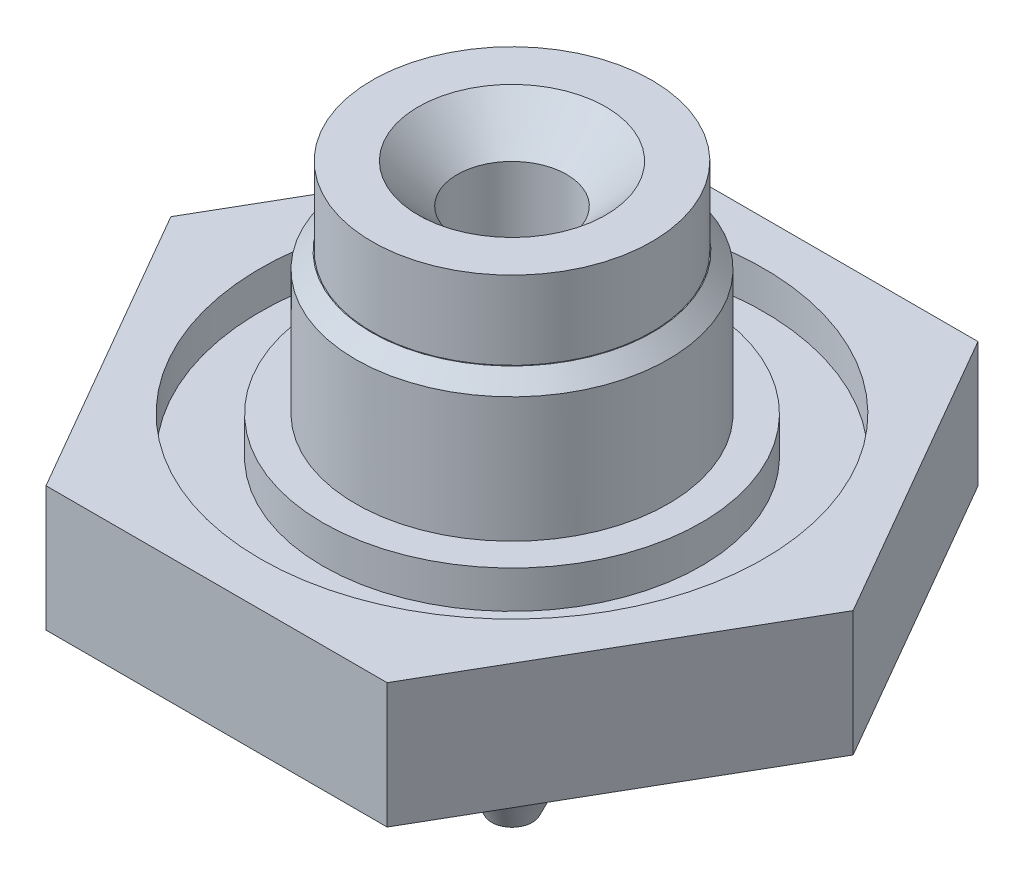
ISO-10303-21;
HEADER;
FILE_DESCRIPTION(('STEP AP214'),'2;1');
FILE_NAME('part.step','',(''),(''),'','','');
FILE_SCHEMA(('AUTOMOTIVE_DESIGN { 1 0 10303 214 1 1 1 1 }'));
ENDSEC;
DATA;
#1=APPLICATION_CONTEXT('core data for automotive mechanical design processes');
#2=APPLICATION_PROTOCOL_DEFINITION('international standard','automotive_design',2000,#1);
#3=PRODUCT_CONTEXT('',#1,'mechanical');
#4=PRODUCT('Part','Part','',(#3));
#5=PRODUCT_RELATED_PRODUCT_CATEGORY('part','',(#4));
#6=PRODUCT_DEFINITION_FORMATION('','',#4);
#7=PRODUCT_DEFINITION_CONTEXT('part definition',#1,'design');
#8=PRODUCT_DEFINITION('design','',#6,#7);
#9=PRODUCT_DEFINITION_SHAPE('','',#8);
#10=(LENGTH_UNIT() NAMED_UNIT(*) SI_UNIT(.MILLI.,.METRE.));
#11=(NAMED_UNIT(*) PLANE_ANGLE_UNIT() SI_UNIT($,.RADIAN.));
#12=(NAMED_UNIT(*) SI_UNIT($,.STERADIAN.) SOLID_ANGLE_UNIT());
#13=UNCERTAINTY_MEASURE_WITH_UNIT(LENGTH_MEASURE(1.E-05),#10,'distance_accuracy_value','');
#14=(GEOMETRIC_REPRESENTATION_CONTEXT(3) GLOBAL_UNCERTAINTY_ASSIGNED_CONTEXT((#13)) GLOBAL_UNIT_ASSIGNED_CONTEXT((#10,
#11,#12)) REPRESENTATION_CONTEXT('',''));
#15=CARTESIAN_POINT('',(0.,0.,0.));
#16=DIRECTION('',(0.,0.,1.));
#17=DIRECTION('',(1.,0.,0.));
#18=AXIS2_PLACEMENT_3D('',#15,#16,#17);
#19=CARTESIAN_POINT('',(5.,11.,0.));
#20=DIRECTION('',(0.,1.,0.));
#21=DIRECTION('',(0.,0.,1.));
#22=AXIS2_PLACEMENT_3D('',#19,#20,#21);
#23=PLANE('',#22);
#24=CARTESIAN_POINT('',(0.,11.,0.));
#25=DIRECTION('',(0.,-1.,0.));
#26=DIRECTION('',(0.,0.,-1.));
#27=AXIS2_PLACEMENT_3D('',#24,#25,#26);
#28=CIRCLE('',#27,5.);
#29=CARTESIAN_POINT('',(0.,11.,-5.));
#30=VERTEX_POINT('',#29);
#31=EDGE_CURVE('E162',#30,#30,#28,.T.);
#32=ORIENTED_EDGE('',*,*,#31,.T.);
#33=EDGE_LOOP('',(#32));
#34=FACE_BOUND('',#33,.T.);
#35=CARTESIAN_POINT('',(0.,11.,0.));
#36=DIRECTION('',(0.,1.,0.));
#37=DIRECTION('',(0.,0.,1.));
#38=AXIS2_PLACEMENT_3D('',#35,#36,#37);
#39=CIRCLE('',#38,6.05);
#40=CARTESIAN_POINT('',(0.,11.,6.05));
#41=VERTEX_POINT('',#40);
#42=EDGE_CURVE('E216',#41,#41,#39,.T.);
#43=ORIENTED_EDGE('',*,*,#42,.T.);
#44=EDGE_LOOP('',(#43));
#45=FACE_BOUND('',#44,.T.);
#46=ADVANCED_FACE('F35',(#34,#45),#23,.T.);
#47=CARTESIAN_POINT('',(12.5,7.,0.));
#48=DIRECTION('',(0.,-1.,0.));
#49=DIRECTION('',(0.,0.,-1.));
#50=AXIS2_PLACEMENT_3D('',#47,#48,#49);
#51=PLANE('',#50);
#52=CARTESIAN_POINT('',(0.,7.,0.));
#53=DIRECTION('',(0.,-1.,0.));
#54=DIRECTION('',(0.,0.,-1.));
#55=AXIS2_PLACEMENT_3D('',#52,#53,#54);
#56=CIRCLE('',#55,3.91415360708497);
#57=CARTESIAN_POINT('',(0.,7.,3.91415360708497));
#58=VERTEX_POINT('',#57);
#59=EDGE_CURVE('E165',#58,#58,#56,.T.);
#60=ORIENTED_EDGE('',*,*,#59,.F.);
#61=EDGE_LOOP('',(#60));
#62=FACE_BOUND('',#61,.T.);
#63=DIRECTION('',(-1.,0.,0.));
#64=VECTOR('',#63,1.);
#65=CARTESIAN_POINT('',(12.5,7.,9.45000000000004));
#66=LINE('',#65,#64);
#67=CARTESIAN_POINT('',(5.45596004384196,7.,9.45000000000004));
#68=VERTEX_POINT('',#67);
#69=CARTESIAN_POINT('',(-5.45596004384195,7.,9.45000000000004));
#70=VERTEX_POINT('',#69);
#71=EDGE_CURVE('E121',#68,#70,#66,.T.);
#72=ORIENTED_EDGE('',*,*,#71,.T.);
#73=DIRECTION('',(-0.499999999999998,0.,-0.86602540378444));
#74=VECTOR('',#73,1.);
#75=CARTESIAN_POINT('',(-5.05894006576299,7.,10.1376587736527));
#76=LINE('',#75,#74);
#77=CARTESIAN_POINT('',(-10.911920087684,7.,0.));
#78=VERTEX_POINT('',#77);
#79=EDGE_CURVE('E138',#70,#78,#76,.T.);
#80=ORIENTED_EDGE('',*,*,#79,.T.);
#81=DIRECTION('',(0.500000000000004,0.,-0.866025403784436));
#82=VECTOR('',#81,1.);
#83=CARTESIAN_POINT('',(-5.05894006576291,7.,-10.1376587736528));
#84=LINE('',#83,#82);
#85=CARTESIAN_POINT('',(-5.45596004384195,7.,-9.45000000000004));
#86=VERTEX_POINT('',#85);
#87=EDGE_CURVE('E135',#78,#86,#84,.T.);
#88=ORIENTED_EDGE('',*,*,#87,.T.);
#89=DIRECTION('',(1.,0.,0.));
#90=VECTOR('',#89,1.);
#91=CARTESIAN_POINT('',(12.5,7.,-9.45000000000004));
#92=LINE('',#91,#90);
#93=CARTESIAN_POINT('',(5.45596004384196,7.,-9.45000000000004));
#94=VERTEX_POINT('',#93);
#95=EDGE_CURVE('E132',#86,#94,#92,.T.);
#96=ORIENTED_EDGE('',*,*,#95,.T.);
#97=DIRECTION('',(0.499999999999998,0.,0.86602540378444));
#98=VECTOR('',#97,1.);
#99=CARTESIAN_POINT('',(11.3089400657629,7.,0.687658773652745));
#100=LINE('',#99,#98);
#101=CARTESIAN_POINT('',(10.911920087684,7.,0.));
#102=VERTEX_POINT('',#101);
#103=EDGE_CURVE('E130',#94,#102,#100,.T.);
#104=ORIENTED_EDGE('',*,*,#103,.T.);
#105=DIRECTION('',(-0.500000000000004,0.,0.866025403784436));
#106=VECTOR('',#105,1.);
#107=CARTESIAN_POINT('',(11.308940065763,7.,-0.687658773652709));
#108=LINE('',#107,#106);
#109=EDGE_CURVE('E91',#102,#68,#108,.T.);
#110=ORIENTED_EDGE('',*,*,#109,.T.);
#111=EDGE_LOOP('',(#72,#80,#88,#96,#104,#110));
#112=FACE_BOUND('',#111,.T.);
#113=ADVANCED_FACE('F189',(#62,#112),#51,.T.);
#114=CARTESIAN_POINT('',(0.,11.,0.));
#115=DIRECTION('',(0.,1.,0.));
#116=DIRECTION('',(0.,0.,1.));
#117=AXIS2_PLACEMENT_3D('',#114,#115,#116);
#118=CIRCLE('',#117,8.05);
#119=CARTESIAN_POINT('',(0.,11.,8.05));
#120=VERTEX_POINT('',#119);
#121=EDGE_CURVE('E208',#120,#120,#118,.T.);
#122=ORIENTED_EDGE('',*,*,#121,.F.);
#123=EDGE_LOOP('',(#122));
#124=FACE_BOUND('',#123,.T.);
#125=DIRECTION('',(-0.500000000000004,0.,0.866025403784436));
#126=VECTOR('',#125,1.);
#127=CARTESIAN_POINT('',(-10.911920087684,11.,0.));
#128=LINE('',#127,#126);
#129=CARTESIAN_POINT('',(-5.45596004384195,11.,-9.45000000000004));
#130=VERTEX_POINT('',#129);
#131=CARTESIAN_POINT('',(-10.911920087684,11.,0.));
#132=VERTEX_POINT('',#131);
#133=EDGE_CURVE('E117',#130,#132,#128,.T.);
#134=ORIENTED_EDGE('',*,*,#133,.T.);
#135=DIRECTION('',(0.499999999999998,0.,0.86602540378444));
#136=VECTOR('',#135,1.);
#137=CARTESIAN_POINT('',(-5.45596004384195,11.,9.45000000000004));
#138=LINE('',#137,#136);
#139=CARTESIAN_POINT('',(-5.45596004384195,11.,9.45000000000004));
#140=VERTEX_POINT('',#139);
#141=EDGE_CURVE('E112',#132,#140,#138,.T.);
#142=ORIENTED_EDGE('',*,*,#141,.T.);
#143=DIRECTION('',(1.,0.,0.));
#144=VECTOR('',#143,1.);
#145=CARTESIAN_POINT('',(5.45596004384196,11.,9.45000000000004));
#146=LINE('',#145,#144);
#147=CARTESIAN_POINT('',(5.45596004384196,11.,9.45000000000004));
#148=VERTEX_POINT('',#147);
#149=EDGE_CURVE('E110',#140,#148,#146,.T.);
#150=ORIENTED_EDGE('',*,*,#149,.T.);
#151=DIRECTION('',(0.500000000000004,0.,-0.866025403784436));
#152=VECTOR('',#151,1.);
#153=CARTESIAN_POINT('',(10.911920087684,11.,0.));
#154=LINE('',#153,#152);
#155=CARTESIAN_POINT('',(10.911920087684,11.,0.));
#156=VERTEX_POINT('',#155);
#157=EDGE_CURVE('E58',#148,#156,#154,.T.);
#158=ORIENTED_EDGE('',*,*,#157,.T.);
#159=DIRECTION('',(-0.499999999999998,0.,-0.86602540378444));
#160=VECTOR('',#159,1.);
#161=CARTESIAN_POINT('',(5.45596004384196,11.,-9.45000000000004));
#162=LINE('',#161,#160);
#163=CARTESIAN_POINT('',(5.45596004384196,11.,-9.45000000000004));
#164=VERTEX_POINT('',#163);
#165=EDGE_CURVE('E98',#156,#164,#162,.T.);
#166=ORIENTED_EDGE('',*,*,#165,.T.);
#167=DIRECTION('',(-1.,0.,0.));
#168=VECTOR('',#167,1.);
#169=CARTESIAN_POINT('',(-5.45596004384195,11.,-9.45000000000004));
#170=LINE('',#169,#168);
#171=EDGE_CURVE('E104',#164,#130,#170,.T.);
#172=ORIENTED_EDGE('',*,*,#171,.T.);
#173=EDGE_LOOP('',(#134,#142,#150,#158,#166,#172));
#174=FACE_BOUND('',#173,.T.);
#175=ADVANCED_FACE('F108',(#124,#174),#23,.T.);
#176=CARTESIAN_POINT('',(0.,0.,0.));
#177=DIRECTION('',(0.,1.,0.));
#178=DIRECTION('',(0.,0.,1.));
#179=AXIS2_PLACEMENT_3D('',#176,#177,#178);
#180=CONICAL_SURFACE('',#179,0.65,0.43633231299858);
#181=CARTESIAN_POINT('',(0.,0.,0.));
#182=DIRECTION('',(0.,-1.,0.));
#183=DIRECTION('',(0.,0.,-1.));
#184=AXIS2_PLACEMENT_3D('',#181,#182,#183);
#185=CIRCLE('',#184,0.65);
#186=CARTESIAN_POINT('',(0.,0.,0.65));
#187=VERTEX_POINT('',#186);
#188=EDGE_CURVE('E141',#187,#187,#185,.T.);
#189=CARTESIAN_POINT('',(0.,7.,3.91415360708497));
#190=CARTESIAN_POINT('',(0.,6.92708333333333,3.88015200701117));
#191=CARTESIAN_POINT('',(0.,6.85416666666666,3.84615040693737));
#192=CARTESIAN_POINT('',(0.,6.70833333333333,3.77814720678976));
#193=CARTESIAN_POINT('',(0.,6.63541666666666,3.74414560671596));
#194=CARTESIAN_POINT('',(0.,6.48958333333333,3.67614240656836));
#195=CARTESIAN_POINT('',(0.,6.41666666666666,3.64214080649456));
#196=CARTESIAN_POINT('',(0.,6.27083333333333,3.57413760634695));
#197=CARTESIAN_POINT('',(0.,6.19791666666666,3.54013600627315));
#198=CARTESIAN_POINT('',(0.,6.05208333333333,3.47213280612555));
#199=CARTESIAN_POINT('',(0.,5.97916666666667,3.43813120605174));
#200=CARTESIAN_POINT('',(0.,5.83333333333333,3.37012800590414));
#201=CARTESIAN_POINT('',(0.,5.76041666666666,3.33612640583034));
#202=CARTESIAN_POINT('',(0.,5.61458333333333,3.26812320568273));
#203=CARTESIAN_POINT('',(0.,5.54166666666666,3.23412160560893));
#204=CARTESIAN_POINT('',(0.,5.39583333333333,3.16611840546133));
#205=CARTESIAN_POINT('',(0.,5.32291666666666,3.13211680538753));
#206=CARTESIAN_POINT('',(0.,5.17708333333333,3.06411360523992));
#207=CARTESIAN_POINT('',(0.,5.10416666666667,3.03011200516612));
#208=CARTESIAN_POINT('',(0.,4.95833333333333,2.96210880501852));
#209=CARTESIAN_POINT('',(0.,4.88541666666666,2.92810720494472));
#210=CARTESIAN_POINT('',(0.,4.73958333333333,2.86010400479711));
#211=CARTESIAN_POINT('',(0.,4.66666666666667,2.82610240472331));
#212=CARTESIAN_POINT('',(0.,4.52083333333333,2.75809920457571));
#213=CARTESIAN_POINT('',(0.,4.44791666666667,2.72409760450191));
#214=CARTESIAN_POINT('',(0.,4.30208333333333,2.6560944043543));
#215=CARTESIAN_POINT('',(0.,4.22916666666667,2.6220928042805));
#216=CARTESIAN_POINT('',(0.,4.08333333333333,2.5540896041329));
#217=CARTESIAN_POINT('',(0.,4.01041666666666,2.5200880040591));
#218=CARTESIAN_POINT('',(0.,3.86458333333333,2.45208480391149));
#219=CARTESIAN_POINT('',(0.,3.79166666666667,2.41808320383769));
#220=CARTESIAN_POINT('',(0.,3.64583333333333,2.35008000369009));
#221=CARTESIAN_POINT('',(0.,3.57291666666667,2.31607840361629));
#222=CARTESIAN_POINT('',(0.,3.42708333333333,2.24807520346868));
#223=CARTESIAN_POINT('',(0.,3.35416666666667,2.21407360339488));
#224=CARTESIAN_POINT('',(0.,3.20833333333333,2.14607040324728));
#225=CARTESIAN_POINT('',(0.,3.13541666666667,2.11206880317348));
#226=CARTESIAN_POINT('',(0.,2.98958333333333,2.04406560302587));
#227=CARTESIAN_POINT('',(0.,2.91666666666667,2.01006400295207));
#228=CARTESIAN_POINT('',(0.,2.77083333333333,1.94206080280447));
#229=CARTESIAN_POINT('',(0.,2.69791666666667,1.90805920273067));
#230=CARTESIAN_POINT('',(0.,2.55208333333333,1.84005600258306));
#231=CARTESIAN_POINT('',(0.,2.47916666666667,1.80605440250926));
#232=CARTESIAN_POINT('',(0.,2.33333333333333,1.73805120236166));
#233=CARTESIAN_POINT('',(0.,2.26041666666667,1.70404960228785));
#234=CARTESIAN_POINT('',(0.,2.11458333333333,1.63604640214025));
#235=CARTESIAN_POINT('',(0.,2.04166666666667,1.60204480206645));
#236=CARTESIAN_POINT('',(0.,1.89583333333333,1.53404160191885));
#237=CARTESIAN_POINT('',(0.,1.82291666666667,1.50004000184504));
#238=CARTESIAN_POINT('',(0.,1.67708333333333,1.43203680169744));
#239=CARTESIAN_POINT('',(0.,1.60416666666667,1.39803520162364));
#240=CARTESIAN_POINT('',(0.,1.45833333333333,1.33003200147604));
#241=CARTESIAN_POINT('',(0.,1.38541666666667,1.29603040140223));
#242=CARTESIAN_POINT('',(0.,1.23958333333333,1.22802720125463));
#243=CARTESIAN_POINT('',(0.,1.16666666666667,1.19402560118083));
#244=CARTESIAN_POINT('',(0.,1.02083333333333,1.12602240103322));
#245=CARTESIAN_POINT('',(0.,0.947916666666666,1.09202080095942));
#246=CARTESIAN_POINT('',(0.,0.802083333333333,1.02401760081182));
#247=CARTESIAN_POINT('',(0.,0.729166666666667,0.990016000738018));
#248=CARTESIAN_POINT('',(0.,0.583333333333333,0.922012800590414));
#249=CARTESIAN_POINT('',(0.,0.510416666666666,0.888011200516612));
#250=CARTESIAN_POINT('',(0.,0.364583333333333,0.820008000369009));
#251=CARTESIAN_POINT('',(0.,0.291666666666667,0.786006400295207));
#252=CARTESIAN_POINT('',(0.,0.145833333333333,0.718003200147604));
#253=CARTESIAN_POINT('',(0.,0.0729166666666666,0.684001600073802));
#254=CARTESIAN_POINT('',(0.,0.,0.65));
#255=B_SPLINE_CURVE_WITH_KNOTS('',3,(#189,#190,#191,#192,#193,#194,#195,#196,#197,#198,#199,
#200,#201,#202,#203,#204,#205,#206,#207,#208,#209,#210,#211,#212,#213,#214,#215,#216,#217,#218,
#219,#220,#221,#222,#223,#224,#225,#226,#227,#228,#229,#230,#231,#232,#233,#234,#235,#236,#237,
#238,#239,#240,#241,#242,#243,#244,#245,#246,#247,#248,#249,#250,#251,#252,#253,#254),
.UNSPECIFIED.,.F.,.F.,(4,2,2,2,2,2,2,2,2,2,2,2,2,2,2,2,2,2,2,2,2,2,2,2,2,2,2,2,2,2,2,2,4),(0.,
0.241363919773045,0.482727839546089,0.724091759319134,0.965455679092179,1.20681959886522,
1.44818351863827,1.68954743841131,1.93091135818436,2.1722752779574,2.41363919773045,
2.65500311750349,2.89636703727654,3.13773095704958,3.37909487682263,3.62045879659567,
3.86182271636872,4.10318663614176,4.3445505559148,4.58591447568785,4.82727839546089,
5.06864231523394,5.31000623500698,5.55137015478003,5.79273407455307,6.03409799432612,
6.27546191409916,6.5168258338722,6.75818975364525,6.99955367341829,7.24091759319134,
7.48228151296438,7.72364543273743),.UNSPECIFIED.);
#256=EDGE_CURVE('BSEAM200',#58,#187,#255,.T.);
#257=ORIENTED_EDGE('',*,*,#59,.T.);
#258=ORIENTED_EDGE('',*,*,#188,.F.);
#259=ORIENTED_EDGE('',*,*,#256,.T.);
#260=ORIENTED_EDGE('',*,*,#256,.F.);
#261=EDGE_LOOP('',(#257,#259,#258,#260));
#262=FACE_BOUND('',#261,.T.);
#263=ADVANCED_FACE('F200',(#262),#180,.T.);
#264=CARTESIAN_POINT('',(0.,0.,0.));
#265=DIRECTION('',(0.,-1.,0.));
#266=DIRECTION('',(0.,0.,-1.));
#267=AXIS2_PLACEMENT_3D('',#264,#265,#266);
#268=CYLINDRICAL_SURFACE('',#267,5.);
#269=CARTESIAN_POINT('',(0.,15.,0.));
#270=DIRECTION('',(0.,1.,0.));
#271=DIRECTION('',(0.,0.,1.));
#272=AXIS2_PLACEMENT_3D('',#269,#270,#271);
#273=CIRCLE('',#272,5.);
#274=CARTESIAN_POINT('',(0.,15.,5.));
#275=VERTEX_POINT('',#274);
#276=EDGE_CURVE('E43',#275,#275,#273,.F.);
#277=ORIENTED_EDGE('',*,*,#276,.T.);
#278=EDGE_LOOP('',(#277));
#279=FACE_BOUND('',#278,.T.);
#280=ORIENTED_EDGE('',*,*,#31,.F.);
#281=EDGE_LOOP('',(#280));
#282=FACE_BOUND('',#281,.T.);
#283=ADVANCED_FACE('F170',(#279,#282),#268,.T.);
#284=CARTESIAN_POINT('',(4.475,15.5,0.));
#285=DIRECTION('',(0.,1.,0.));
#286=DIRECTION('',(0.,0.,1.));
#287=AXIS2_PLACEMENT_3D('',#284,#285,#286);
#288=PLANE('',#287);
#289=CARTESIAN_POINT('',(0.,15.5,0.));
#290=DIRECTION('',(0.,1.,0.));
#291=DIRECTION('',(0.,0.,1.));
#292=AXIS2_PLACEMENT_3D('',#289,#290,#291);
#293=CIRCLE('',#292,4.49999999999999);
#294=CARTESIAN_POINT('',(0.,15.5,4.49999999999999));
#295=VERTEX_POINT('',#294);
#296=EDGE_CURVE('E11',#295,#295,#293,.T.);
#297=ORIENTED_EDGE('',*,*,#296,.T.);
#298=EDGE_LOOP('',(#297));
#299=FACE_BOUND('',#298,.T.);
#300=CARTESIAN_POINT('',(0.,15.5,0.));
#301=DIRECTION('',(0.,-1.,0.));
#302=DIRECTION('',(0.,0.,-1.));
#303=AXIS2_PLACEMENT_3D('',#300,#301,#302);
#304=CIRCLE('',#303,4.475);
#305=CARTESIAN_POINT('',(0.,15.5,-4.475));
#306=VERTEX_POINT('',#305);
#307=EDGE_CURVE('E159',#306,#306,#304,.T.);
#308=ORIENTED_EDGE('',*,*,#307,.T.);
#309=EDGE_LOOP('',(#308));
#310=FACE_BOUND('',#309,.T.);
#311=ADVANCED_FACE('F262',(#299,#310),#288,.T.);
#312=CARTESIAN_POINT('',(0.,0.,0.));
#313=DIRECTION('',(0.,-1.,0.));
#314=DIRECTION('',(0.,0.,-1.));
#315=AXIS2_PLACEMENT_3D('',#312,#313,#314);
#316=CYLINDRICAL_SURFACE('',#315,4.475);
#317=CARTESIAN_POINT('',(0.,18.,0.));
#318=DIRECTION('',(0.,-1.,0.));
#319=DIRECTION('',(0.,0.,-1.));
#320=AXIS2_PLACEMENT_3D('',#317,#318,#319);
#321=CIRCLE('',#320,4.475);
#322=CARTESIAN_POINT('',(0.,18.,-4.475));
#323=VERTEX_POINT('',#322);
#324=EDGE_CURVE('E156',#323,#323,#321,.T.);
#325=ORIENTED_EDGE('',*,*,#324,.T.);
#326=EDGE_LOOP('',(#325));
#327=FACE_BOUND('',#326,.T.);
#328=ORIENTED_EDGE('',*,*,#307,.F.);
#329=EDGE_LOOP('',(#328));
#330=FACE_BOUND('',#329,.T.);
#331=ADVANCED_FACE('F258',(#327,#330),#316,.T.);
#332=CARTESIAN_POINT('',(3.,18.,0.));
#333=DIRECTION('',(0.,1.,0.));
#334=DIRECTION('',(0.,0.,1.));
#335=AXIS2_PLACEMENT_3D('',#332,#333,#334);
#336=PLANE('',#335);
#337=CARTESIAN_POINT('',(0.,18.,0.));
#338=DIRECTION('',(0.,-1.,0.));
#339=DIRECTION('',(0.,0.,-1.));
#340=AXIS2_PLACEMENT_3D('',#337,#338,#339);
#341=CIRCLE('',#340,3.);
#342=CARTESIAN_POINT('',(0.,18.,-3.));
#343=VERTEX_POINT('',#342);
#344=EDGE_CURVE('E153',#343,#343,#341,.T.);
#345=ORIENTED_EDGE('',*,*,#344,.T.);
#346=EDGE_LOOP('',(#345));
#347=FACE_BOUND('',#346,.T.);
#348=ORIENTED_EDGE('',*,*,#324,.F.);
#349=EDGE_LOOP('',(#348));
#350=FACE_BOUND('',#349,.T.);
#351=ADVANCED_FACE('F254',(#347,#350),#336,.T.);
#352=CARTESIAN_POINT('',(0.,18.,0.));
#353=DIRECTION('',(0.,1.,0.));
#354=DIRECTION('',(0.,0.,1.));
#355=AXIS2_PLACEMENT_3D('',#352,#353,#354);
#356=CONICAL_SURFACE('',#355,3.,0.785398163397449);
#357=CARTESIAN_POINT('',(0.,16.75,0.));
#358=DIRECTION('',(0.,-1.,0.));
#359=DIRECTION('',(0.,0.,-1.));
#360=AXIS2_PLACEMENT_3D('',#357,#358,#359);
#361=CIRCLE('',#360,1.75);
#362=CARTESIAN_POINT('',(0.,16.75,-1.75));
#363=VERTEX_POINT('',#362);
#364=EDGE_CURVE('E150',#363,#363,#361,.T.);
#365=ORIENTED_EDGE('',*,*,#364,.T.);
#366=EDGE_LOOP('',(#365));
#367=FACE_BOUND('',#366,.T.);
#368=ORIENTED_EDGE('',*,*,#344,.F.);
#369=EDGE_LOOP('',(#368));
#370=FACE_BOUND('',#369,.T.);
#371=ADVANCED_FACE('F250',(#367,#370),#356,.F.);
#372=CARTESIAN_POINT('',(0.,0.,0.));
#373=DIRECTION('',(0.,-1.,0.));
#374=DIRECTION('',(0.,0.,-1.));
#375=AXIS2_PLACEMENT_3D('',#372,#373,#374);
#376=CYLINDRICAL_SURFACE('',#375,1.75);
#377=CARTESIAN_POINT('',(0.,3.6,0.));
#378=DIRECTION('',(0.,-1.,0.));
#379=DIRECTION('',(0.,0.,-1.));
#380=AXIS2_PLACEMENT_3D('',#377,#378,#379);
#381=CIRCLE('',#380,1.75);
#382=CARTESIAN_POINT('',(0.,3.6,-1.75));
#383=VERTEX_POINT('',#382);
#384=EDGE_CURVE('E147',#383,#383,#381,.T.);
#385=ORIENTED_EDGE('',*,*,#384,.T.);
#386=EDGE_LOOP('',(#385));
#387=FACE_BOUND('',#386,.T.);
#388=ORIENTED_EDGE('',*,*,#364,.F.);
#389=EDGE_LOOP('',(#388));
#390=FACE_BOUND('',#389,.T.);
#391=ADVANCED_FACE('F246',(#387,#390),#376,.F.);
#392=CARTESIAN_POINT('',(0.,3.6,0.));
#393=DIRECTION('',(0.,1.,0.));
#394=DIRECTION('',(0.,0.,1.));
#395=AXIS2_PLACEMENT_3D('',#392,#393,#394);
#396=CONICAL_SURFACE('',#395,1.75,0.78539816339745);
#397=CARTESIAN_POINT('',(0.,2.5,0.));
#398=DIRECTION('',(0.,-1.,0.));
#399=DIRECTION('',(0.,0.,-1.));
#400=AXIS2_PLACEMENT_3D('',#397,#398,#399);
#401=CIRCLE('',#400,0.65);
#402=CARTESIAN_POINT('',(0.,2.5,-0.65));
#403=VERTEX_POINT('',#402);
#404=EDGE_CURVE('E144',#403,#403,#401,.T.);
#405=ORIENTED_EDGE('',*,*,#404,.T.);
#406=EDGE_LOOP('',(#405));
#407=FACE_BOUND('',#406,.T.);
#408=ORIENTED_EDGE('',*,*,#384,.F.);
#409=EDGE_LOOP('',(#408));
#410=FACE_BOUND('',#409,.T.);
#411=ADVANCED_FACE('F184',(#407,#410),#396,.F.);
#412=CARTESIAN_POINT('',(0.,0.,0.));
#413=DIRECTION('',(0.,-1.,0.));
#414=DIRECTION('',(0.,0.,-1.));
#415=AXIS2_PLACEMENT_3D('',#412,#413,#414);
#416=CYLINDRICAL_SURFACE('',#415,0.65);
#417=ORIENTED_EDGE('',*,*,#188,.T.);
#418=EDGE_LOOP('',(#417));
#419=FACE_BOUND('',#418,.T.);
#420=ORIENTED_EDGE('',*,*,#404,.F.);
#421=EDGE_LOOP('',(#420));
#422=FACE_BOUND('',#421,.T.);
#423=ADVANCED_FACE('F175',(#419,#422),#416,.F.);
#424=CARTESIAN_POINT('',(0.,15.,0.));
#425=DIRECTION('',(0.,-1.,0.));
#426=DIRECTION('',(0.,0.,-1.));
#427=AXIS2_PLACEMENT_3D('',#424,#425,#426);
#428=CONICAL_SURFACE('',#427,5.,0.785398163397452);
#429=ORIENTED_EDGE('',*,*,#296,.F.);
#430=EDGE_LOOP('',(#429));
#431=FACE_BOUND('',#430,.T.);
#432=ORIENTED_EDGE('',*,*,#276,.F.);
#433=EDGE_LOOP('',(#432));
#434=FACE_BOUND('',#433,.T.);
#435=ADVANCED_FACE('F37',(#431,#434),#428,.T.);
#436=CARTESIAN_POINT('',(-5.45596004384195,0.,9.45000000000004));
#437=DIRECTION('',(-0.86602540378444,0.,0.499999999999998));
#438=DIRECTION('',(0.499999999999998,0.,0.86602540378444));
#439=AXIS2_PLACEMENT_3D('',#436,#437,#438);
#440=PLANE('',#439);
#441=DIRECTION('',(0.,1.,0.));
#442=VECTOR('',#441,1.);
#443=CARTESIAN_POINT('',(-5.45596004384195,0.,9.45000000000004));
#444=LINE('',#443,#442);
#445=EDGE_CURVE('E50',#70,#140,#444,.T.);
#446=ORIENTED_EDGE('',*,*,#445,.T.);
#447=ORIENTED_EDGE('',*,*,#141,.F.);
#448=DIRECTION('',(0.,1.,0.));
#449=VECTOR('',#448,1.);
#450=CARTESIAN_POINT('',(-10.911920087684,0.,0.));
#451=LINE('',#450,#449);
#452=EDGE_CURVE('E119',#78,#132,#451,.T.);
#453=ORIENTED_EDGE('',*,*,#452,.F.);
#454=ORIENTED_EDGE('',*,*,#79,.F.);
#455=EDGE_LOOP('',(#446,#447,#453,#454));
#456=FACE_BOUND('',#455,.T.);
#457=ADVANCED_FACE('F174',(#456),#440,.T.);
#458=CARTESIAN_POINT('',(-10.911920087684,0.,0.));
#459=DIRECTION('',(-0.866025403784436,0.,-0.500000000000004));
#460=DIRECTION('',(-0.500000000000004,0.,0.866025403784436));
#461=AXIS2_PLACEMENT_3D('',#458,#459,#460);
#462=PLANE('',#461);
#463=ORIENTED_EDGE('',*,*,#452,.T.);
#464=ORIENTED_EDGE('',*,*,#133,.F.);
#465=DIRECTION('',(0.,1.,0.));
#466=VECTOR('',#465,1.);
#467=CARTESIAN_POINT('',(-5.45596004384195,0.,-9.45000000000004));
#468=LINE('',#467,#466);
#469=EDGE_CURVE('E122',#86,#130,#468,.T.);
#470=ORIENTED_EDGE('',*,*,#469,.F.);
#471=ORIENTED_EDGE('',*,*,#87,.F.);
#472=EDGE_LOOP('',(#463,#464,#470,#471));
#473=FACE_BOUND('',#472,.T.);
#474=ADVANCED_FACE('F181',(#473),#462,.T.);
#475=CARTESIAN_POINT('',(-5.45596004384195,0.,-9.45000000000004));
#476=DIRECTION('',(0.,0.,-1.));
#477=DIRECTION('',(-1.,0.,0.));
#478=AXIS2_PLACEMENT_3D('',#475,#476,#477);
#479=PLANE('',#478);
#480=ORIENTED_EDGE('',*,*,#469,.T.);
#481=ORIENTED_EDGE('',*,*,#171,.F.);
#482=DIRECTION('',(0.,1.,0.));
#483=VECTOR('',#482,1.);
#484=CARTESIAN_POINT('',(5.45596004384196,0.,-9.45000000000004));
#485=LINE('',#484,#483);
#486=EDGE_CURVE('E94',#94,#164,#485,.T.);
#487=ORIENTED_EDGE('',*,*,#486,.F.);
#488=ORIENTED_EDGE('',*,*,#95,.F.);
#489=EDGE_LOOP('',(#480,#481,#487,#488));
#490=FACE_BOUND('',#489,.T.);
#491=ADVANCED_FACE('F225',(#490),#479,.T.);
#492=CARTESIAN_POINT('',(5.45596004384196,0.,-9.45000000000004));
#493=DIRECTION('',(0.86602540378444,0.,-0.499999999999998));
#494=DIRECTION('',(-0.499999999999998,0.,-0.86602540378444));
#495=AXIS2_PLACEMENT_3D('',#492,#493,#494);
#496=PLANE('',#495);
#497=ORIENTED_EDGE('',*,*,#486,.T.);
#498=ORIENTED_EDGE('',*,*,#165,.F.);
#499=DIRECTION('',(0.,1.,0.));
#500=VECTOR('',#499,1.);
#501=CARTESIAN_POINT('',(10.911920087684,0.,0.));
#502=LINE('',#501,#500);
#503=EDGE_CURVE('E87',#102,#156,#502,.T.);
#504=ORIENTED_EDGE('',*,*,#503,.F.);
#505=ORIENTED_EDGE('',*,*,#103,.F.);
#506=EDGE_LOOP('',(#497,#498,#504,#505));
#507=FACE_BOUND('',#506,.T.);
#508=ADVANCED_FACE('F99',(#507),#496,.T.);
#509=CARTESIAN_POINT('',(10.911920087684,0.,0.));
#510=DIRECTION('',(0.866025403784436,0.,0.500000000000004));
#511=DIRECTION('',(0.500000000000004,0.,-0.866025403784436));
#512=AXIS2_PLACEMENT_3D('',#509,#510,#511);
#513=PLANE('',#512);
#514=ORIENTED_EDGE('',*,*,#503,.T.);
#515=ORIENTED_EDGE('',*,*,#157,.F.);
#516=DIRECTION('',(0.,1.,0.));
#517=VECTOR('',#516,1.);
#518=CARTESIAN_POINT('',(5.45596004384196,0.,9.45000000000004));
#519=LINE('',#518,#517);
#520=EDGE_CURVE('E95',#68,#148,#519,.T.);
#521=ORIENTED_EDGE('',*,*,#520,.F.);
#522=ORIENTED_EDGE('',*,*,#109,.F.);
#523=EDGE_LOOP('',(#514,#515,#521,#522));
#524=FACE_BOUND('',#523,.T.);
#525=ADVANCED_FACE('F89',(#524),#513,.T.);
#526=CARTESIAN_POINT('',(5.45596004384196,0.,9.45000000000004));
#527=DIRECTION('',(0.,0.,1.));
#528=DIRECTION('',(1.,0.,0.));
#529=AXIS2_PLACEMENT_3D('',#526,#527,#528);
#530=PLANE('',#529);
#531=ORIENTED_EDGE('',*,*,#520,.T.);
#532=ORIENTED_EDGE('',*,*,#149,.F.);
#533=ORIENTED_EDGE('',*,*,#445,.F.);
#534=ORIENTED_EDGE('',*,*,#71,.F.);
#535=EDGE_LOOP('',(#531,#532,#533,#534));
#536=FACE_BOUND('',#535,.T.);
#537=ADVANCED_FACE('F222',(#536),#530,.T.);
#538=CARTESIAN_POINT('',(0.,9.8,0.));
#539=DIRECTION('',(0.,1.,0.));
#540=DIRECTION('',(0.,0.,1.));
#541=AXIS2_PLACEMENT_3D('',#538,#539,#540);
#542=CYLINDRICAL_SURFACE('',#541,8.05);
#543=CARTESIAN_POINT('',(0.,9.8,0.));
#544=DIRECTION('',(0.,1.,0.));
#545=DIRECTION('',(0.,0.,1.));
#546=AXIS2_PLACEMENT_3D('',#543,#544,#545);
#547=CIRCLE('',#546,8.05);
#548=CARTESIAN_POINT('',(0.,9.8,8.05));
#549=VERTEX_POINT('',#548);
#550=EDGE_CURVE('E210',#549,#549,#547,.T.);
#551=ORIENTED_EDGE('',*,*,#550,.F.);
#552=EDGE_LOOP('',(#551));
#553=FACE_BOUND('',#552,.T.);
#554=ORIENTED_EDGE('',*,*,#121,.T.);
#555=EDGE_LOOP('',(#554));
#556=FACE_BOUND('',#555,.T.);
#557=ADVANCED_FACE('F235',(#553,#556),#542,.F.);
#558=CARTESIAN_POINT('',(0.,9.8,0.));
#559=DIRECTION('',(0.,1.,0.));
#560=DIRECTION('',(0.,0.,1.));
#561=AXIS2_PLACEMENT_3D('',#558,#559,#560);
#562=PLANE('',#561);
#563=CARTESIAN_POINT('',(0.,9.8,0.));
#564=DIRECTION('',(0.,1.,0.));
#565=DIRECTION('',(0.,0.,1.));
#566=AXIS2_PLACEMENT_3D('',#563,#564,#565);
#567=CIRCLE('',#566,6.05);
#568=CARTESIAN_POINT('',(0.,9.8,6.05));
#569=VERTEX_POINT('',#568);
#570=EDGE_CURVE('E211',#569,#569,#567,.T.);
#571=ORIENTED_EDGE('',*,*,#570,.F.);
#572=EDGE_LOOP('',(#571));
#573=FACE_BOUND('',#572,.T.);
#574=ORIENTED_EDGE('',*,*,#550,.T.);
#575=EDGE_LOOP('',(#574));
#576=FACE_BOUND('',#575,.T.);
#577=ADVANCED_FACE('F357',(#573,#576),#562,.T.);
#578=CARTESIAN_POINT('',(0.,9.8,0.));
#579=DIRECTION('',(0.,1.,0.));
#580=DIRECTION('',(0.,0.,1.));
#581=AXIS2_PLACEMENT_3D('',#578,#579,#580);
#582=CYLINDRICAL_SURFACE('',#581,6.05);
#583=ORIENTED_EDGE('',*,*,#570,.T.);
#584=EDGE_LOOP('',(#583));
#585=FACE_BOUND('',#584,.T.);
#586=ORIENTED_EDGE('',*,*,#42,.F.);
#587=EDGE_LOOP('',(#586));
#588=FACE_BOUND('',#587,.T.);
#589=ADVANCED_FACE('F365',(#585,#588),#582,.T.);
#590=CLOSED_SHELL('',(#46,#113,#175,#263,#283,#311,#331,#351,#371,#391,#411,#423,#435,#457,#474,
#491,#508,#525,#537,#557,#577,#589));
#591=MANIFOLD_SOLID_BREP('B2',#590);
#592=ADVANCED_BREP_SHAPE_REPRESENTATION('',(#18,#591),#14);
#593=SHAPE_DEFINITION_REPRESENTATION(#9,#592);
ENDSEC;
END-ISO-10303-21;
